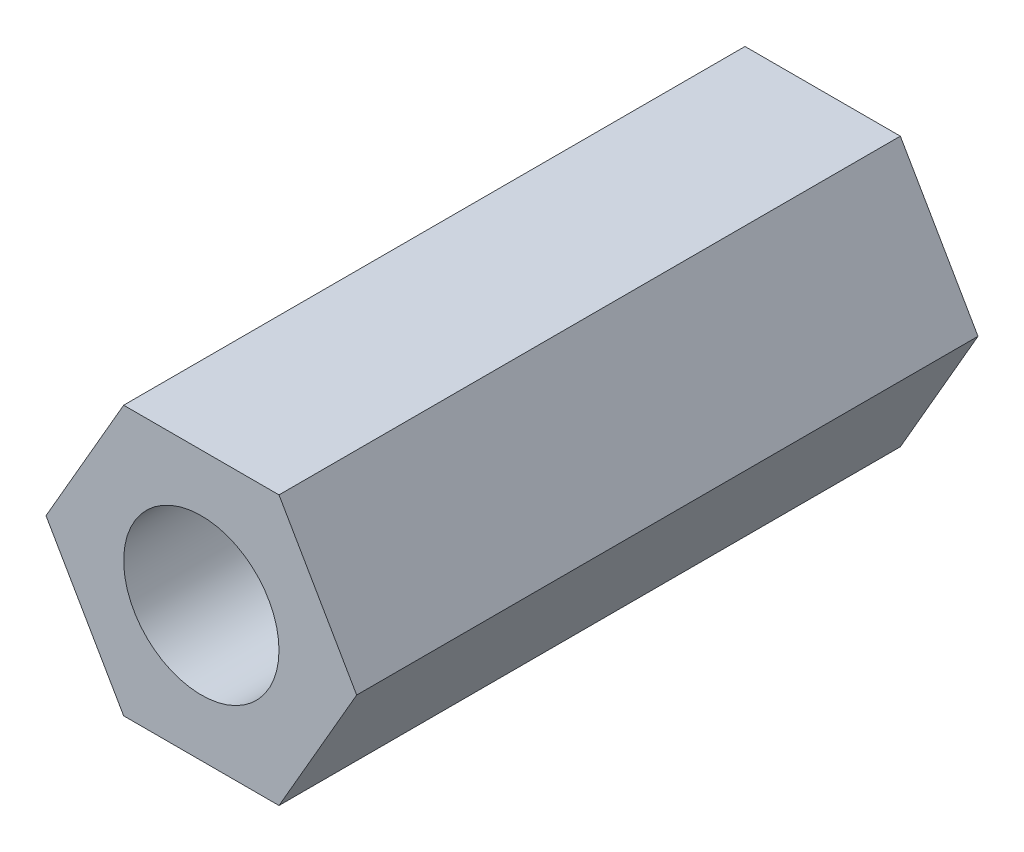
ISO-10303-21;
HEADER;
FILE_DESCRIPTION(('STEP AP214'),'2;1');
FILE_NAME('part.step','',(''),(''),'','','');
FILE_SCHEMA(('AUTOMOTIVE_DESIGN { 1 0 10303 214 1 1 1 1 }'));
ENDSEC;
DATA;
#1=APPLICATION_CONTEXT('core data for automotive mechanical design processes');
#2=APPLICATION_PROTOCOL_DEFINITION('international standard','automotive_design',2000,#1);
#3=PRODUCT_CONTEXT('',#1,'mechanical');
#4=PRODUCT('Part','Part','',(#3));
#5=PRODUCT_RELATED_PRODUCT_CATEGORY('part','',(#4));
#6=PRODUCT_DEFINITION_FORMATION('','',#4);
#7=PRODUCT_DEFINITION_CONTEXT('part definition',#1,'design');
#8=PRODUCT_DEFINITION('design','',#6,#7);
#9=PRODUCT_DEFINITION_SHAPE('','',#8);
#10=(LENGTH_UNIT() NAMED_UNIT(*) SI_UNIT(.MILLI.,.METRE.));
#11=(NAMED_UNIT(*) PLANE_ANGLE_UNIT() SI_UNIT($,.RADIAN.));
#12=(NAMED_UNIT(*) SI_UNIT($,.STERADIAN.) SOLID_ANGLE_UNIT());
#13=UNCERTAINTY_MEASURE_WITH_UNIT(LENGTH_MEASURE(1.E-05),#10,'distance_accuracy_value','');
#14=(GEOMETRIC_REPRESENTATION_CONTEXT(3) GLOBAL_UNCERTAINTY_ASSIGNED_CONTEXT((#13)) GLOBAL_UNIT_ASSIGNED_CONTEXT((#10,
#11,#12)) REPRESENTATION_CONTEXT('',''));
#15=CARTESIAN_POINT('',(0.,0.,0.));
#16=DIRECTION('',(0.,0.,1.));
#17=DIRECTION('',(1.,0.,0.));
#18=AXIS2_PLACEMENT_3D('',#15,#16,#17);
#19=CARTESIAN_POINT('',(-1.25,-2.1650635094611,10.));
#20=DIRECTION('',(0.866025403784439,-0.5,0.));
#21=DIRECTION('',(0.5,0.866025403784439,0.));
#22=AXIS2_PLACEMENT_3D('',#19,#20,#21);
#23=PLANE('',#22);
#24=DIRECTION('',(-0.5,-0.866025403784439,0.));
#25=VECTOR('',#24,1.);
#26=CARTESIAN_POINT('',(-1.25,-2.1650635094611,0.));
#27=LINE('',#26,#25);
#28=CARTESIAN_POINT('',(0.,0.,0.));
#29=VERTEX_POINT('',#28);
#30=CARTESIAN_POINT('',(-1.25,-2.1650635094611,0.));
#31=VERTEX_POINT('',#30);
#32=EDGE_CURVE('E120',#29,#31,#27,.T.);
#33=ORIENTED_EDGE('',*,*,#32,.T.);
#34=DIRECTION('',(0.,0.,-1.));
#35=VECTOR('',#34,1.);
#36=CARTESIAN_POINT('',(-1.25,-2.1650635094611,10.));
#37=LINE('',#36,#35);
#38=CARTESIAN_POINT('',(-1.25,-2.1650635094611,10.));
#39=VERTEX_POINT('',#38);
#40=EDGE_CURVE('E11',#39,#31,#37,.T.);
#41=ORIENTED_EDGE('',*,*,#40,.F.);
#42=DIRECTION('',(-0.5,-0.866025403784439,0.));
#43=VECTOR('',#42,1.);
#44=CARTESIAN_POINT('',(-1.25,-2.1650635094611,10.));
#45=LINE('',#44,#43);
#46=CARTESIAN_POINT('',(0.,0.,10.));
#47=VERTEX_POINT('',#46);
#48=EDGE_CURVE('E131',#47,#39,#45,.T.);
#49=ORIENTED_EDGE('',*,*,#48,.F.);
#50=DIRECTION('',(0.,0.,-1.));
#51=VECTOR('',#50,1.);
#52=CARTESIAN_POINT('',(0.,0.,10.));
#53=LINE('',#52,#51);
#54=EDGE_CURVE('E116',#47,#29,#53,.T.);
#55=ORIENTED_EDGE('',*,*,#54,.T.);
#56=EDGE_LOOP('',(#33,#41,#49,#55));
#57=FACE_BOUND('',#56,.T.);
#58=ADVANCED_FACE('F36',(#57),#23,.F.);
#59=CARTESIAN_POINT('',(0.,-4.33012701892219,10.));
#60=DIRECTION('',(0.866025403784439,0.5,0.));
#61=DIRECTION('',(-0.5,0.866025403784439,0.));
#62=AXIS2_PLACEMENT_3D('',#59,#60,#61);
#63=PLANE('',#62);
#64=DIRECTION('',(0.5,-0.866025403784439,0.));
#65=VECTOR('',#64,1.);
#66=CARTESIAN_POINT('',(0.,-4.33012701892219,0.));
#67=LINE('',#66,#65);
#68=CARTESIAN_POINT('',(0.,-4.33012701892219,0.));
#69=VERTEX_POINT('',#68);
#70=EDGE_CURVE('E123',#31,#69,#67,.T.);
#71=ORIENTED_EDGE('',*,*,#70,.T.);
#72=DIRECTION('',(0.,0.,-1.));
#73=VECTOR('',#72,1.);
#74=CARTESIAN_POINT('',(0.,-4.33012701892219,10.));
#75=LINE('',#74,#73);
#76=CARTESIAN_POINT('',(0.,-4.33012701892219,10.));
#77=VERTEX_POINT('',#76);
#78=EDGE_CURVE('E44',#77,#69,#75,.T.);
#79=ORIENTED_EDGE('',*,*,#78,.F.);
#80=DIRECTION('',(0.5,-0.866025403784439,0.));
#81=VECTOR('',#80,1.);
#82=CARTESIAN_POINT('',(0.,-4.33012701892219,10.));
#83=LINE('',#82,#81);
#84=EDGE_CURVE('E89',#39,#77,#83,.T.);
#85=ORIENTED_EDGE('',*,*,#84,.F.);
#86=ORIENTED_EDGE('',*,*,#40,.T.);
#87=EDGE_LOOP('',(#71,#79,#85,#86));
#88=FACE_BOUND('',#87,.T.);
#89=ADVANCED_FACE('F156',(#88),#63,.F.);
#90=CARTESIAN_POINT('',(2.5,-4.33012701892219,10.));
#91=DIRECTION('',(0.,1.,0.));
#92=DIRECTION('',(0.,0.,1.));
#93=AXIS2_PLACEMENT_3D('',#90,#91,#92);
#94=PLANE('',#93);
#95=DIRECTION('',(1.,0.,0.));
#96=VECTOR('',#95,1.);
#97=CARTESIAN_POINT('',(2.5,-4.33012701892219,0.));
#98=LINE('',#97,#96);
#99=CARTESIAN_POINT('',(2.5,-4.33012701892219,0.));
#100=VERTEX_POINT('',#99);
#101=EDGE_CURVE('E126',#69,#100,#98,.T.);
#102=ORIENTED_EDGE('',*,*,#101,.T.);
#103=DIRECTION('',(0.,0.,-1.));
#104=VECTOR('',#103,1.);
#105=CARTESIAN_POINT('',(2.5,-4.33012701892219,10.));
#106=LINE('',#105,#104);
#107=CARTESIAN_POINT('',(2.5,-4.33012701892219,10.));
#108=VERTEX_POINT('',#107);
#109=EDGE_CURVE('E111',#108,#100,#106,.T.);
#110=ORIENTED_EDGE('',*,*,#109,.F.);
#111=DIRECTION('',(1.,0.,0.));
#112=VECTOR('',#111,1.);
#113=CARTESIAN_POINT('',(2.5,-4.33012701892219,10.));
#114=LINE('',#113,#112);
#115=EDGE_CURVE('E102',#77,#108,#114,.T.);
#116=ORIENTED_EDGE('',*,*,#115,.F.);
#117=ORIENTED_EDGE('',*,*,#78,.T.);
#118=EDGE_LOOP('',(#102,#110,#116,#117));
#119=FACE_BOUND('',#118,.T.);
#120=ADVANCED_FACE('F137',(#119),#94,.F.);
#121=CARTESIAN_POINT('',(3.75,-2.1650635094611,10.));
#122=DIRECTION('',(-0.866025403784439,0.5,0.));
#123=DIRECTION('',(-0.5,-0.866025403784439,0.));
#124=AXIS2_PLACEMENT_3D('',#121,#122,#123);
#125=PLANE('',#124);
#126=DIRECTION('',(0.5,0.866025403784439,0.));
#127=VECTOR('',#126,1.);
#128=CARTESIAN_POINT('',(3.75,-2.1650635094611,0.));
#129=LINE('',#128,#127);
#130=CARTESIAN_POINT('',(3.75,-2.1650635094611,0.));
#131=VERTEX_POINT('',#130);
#132=EDGE_CURVE('E110',#100,#131,#129,.T.);
#133=ORIENTED_EDGE('',*,*,#132,.T.);
#134=DIRECTION('',(0.,0.,-1.));
#135=VECTOR('',#134,1.);
#136=CARTESIAN_POINT('',(3.75,-2.1650635094611,10.));
#137=LINE('',#136,#135);
#138=CARTESIAN_POINT('',(3.75,-2.1650635094611,10.));
#139=VERTEX_POINT('',#138);
#140=EDGE_CURVE('E107',#139,#131,#137,.T.);
#141=ORIENTED_EDGE('',*,*,#140,.F.);
#142=DIRECTION('',(0.5,0.866025403784439,0.));
#143=VECTOR('',#142,1.);
#144=CARTESIAN_POINT('',(3.75,-2.1650635094611,10.));
#145=LINE('',#144,#143);
#146=EDGE_CURVE('E96',#108,#139,#145,.T.);
#147=ORIENTED_EDGE('',*,*,#146,.F.);
#148=ORIENTED_EDGE('',*,*,#109,.T.);
#149=EDGE_LOOP('',(#133,#141,#147,#148));
#150=FACE_BOUND('',#149,.T.);
#151=ADVANCED_FACE('F108',(#150),#125,.F.);
#152=CARTESIAN_POINT('',(2.5,0.,10.));
#153=DIRECTION('',(-0.866025403784439,-0.5,0.));
#154=DIRECTION('',(0.5,-0.866025403784439,0.));
#155=AXIS2_PLACEMENT_3D('',#152,#153,#154);
#156=PLANE('',#155);
#157=DIRECTION('',(-0.5,0.866025403784439,0.));
#158=VECTOR('',#157,1.);
#159=CARTESIAN_POINT('',(2.5,0.,0.));
#160=LINE('',#159,#158);
#161=CARTESIAN_POINT('',(2.5,0.,0.));
#162=VERTEX_POINT('',#161);
#163=EDGE_CURVE('E75',#131,#162,#160,.T.);
#164=ORIENTED_EDGE('',*,*,#163,.T.);
#165=DIRECTION('',(0.,0.,-1.));
#166=VECTOR('',#165,1.);
#167=CARTESIAN_POINT('',(2.5,0.,10.));
#168=LINE('',#167,#166);
#169=CARTESIAN_POINT('',(2.5,0.,10.));
#170=VERTEX_POINT('',#169);
#171=EDGE_CURVE('E112',#170,#162,#168,.T.);
#172=ORIENTED_EDGE('',*,*,#171,.F.);
#173=DIRECTION('',(-0.5,0.866025403784439,0.));
#174=VECTOR('',#173,1.);
#175=CARTESIAN_POINT('',(2.5,0.,10.));
#176=LINE('',#175,#174);
#177=EDGE_CURVE('E100',#139,#170,#176,.T.);
#178=ORIENTED_EDGE('',*,*,#177,.F.);
#179=ORIENTED_EDGE('',*,*,#140,.T.);
#180=EDGE_LOOP('',(#164,#172,#178,#179));
#181=FACE_BOUND('',#180,.T.);
#182=ADVANCED_FACE('F114',(#181),#156,.F.);
#183=CARTESIAN_POINT('',(0.,0.,10.));
#184=DIRECTION('',(0.,-1.,0.));
#185=DIRECTION('',(0.,0.,-1.));
#186=AXIS2_PLACEMENT_3D('',#183,#184,#185);
#187=PLANE('',#186);
#188=DIRECTION('',(-1.,0.,0.));
#189=VECTOR('',#188,1.);
#190=CARTESIAN_POINT('',(0.,0.,0.));
#191=LINE('',#190,#189);
#192=EDGE_CURVE('E81',#162,#29,#191,.T.);
#193=ORIENTED_EDGE('',*,*,#192,.T.);
#194=ORIENTED_EDGE('',*,*,#54,.F.);
#195=DIRECTION('',(-1.,0.,0.));
#196=VECTOR('',#195,1.);
#197=CARTESIAN_POINT('',(0.,0.,10.));
#198=LINE('',#197,#196);
#199=EDGE_CURVE('E52',#170,#47,#198,.T.);
#200=ORIENTED_EDGE('',*,*,#199,.F.);
#201=ORIENTED_EDGE('',*,*,#171,.T.);
#202=EDGE_LOOP('',(#193,#194,#200,#201));
#203=FACE_BOUND('',#202,.T.);
#204=ADVANCED_FACE('F144',(#203),#187,.F.);
#205=CARTESIAN_POINT('',(0.,0.,10.));
#206=DIRECTION('',(0.,0.,-1.));
#207=DIRECTION('',(-1.,0.,0.));
#208=AXIS2_PLACEMENT_3D('',#205,#206,#207);
#209=PLANE('',#208);
#210=CARTESIAN_POINT('',(1.25,-2.1650635094611,10.));
#211=DIRECTION('',(0.,0.,1.));
#212=DIRECTION('',(1.,0.,0.));
#213=AXIS2_PLACEMENT_3D('',#210,#211,#212);
#214=CIRCLE('',#213,1.24999999999999);
#215=CARTESIAN_POINT('',(2.49999999999999,-2.1650635094611,10.));
#216=VERTEX_POINT('',#215);
#217=EDGE_CURVE('E213',#216,#216,#214,.T.);
#218=ORIENTED_EDGE('',*,*,#217,.F.);
#219=EDGE_LOOP('',(#218));
#220=FACE_BOUND('',#219,.T.);
#221=ORIENTED_EDGE('',*,*,#48,.T.);
#222=ORIENTED_EDGE('',*,*,#84,.T.);
#223=ORIENTED_EDGE('',*,*,#115,.T.);
#224=ORIENTED_EDGE('',*,*,#146,.T.);
#225=ORIENTED_EDGE('',*,*,#177,.T.);
#226=ORIENTED_EDGE('',*,*,#199,.T.);
#227=EDGE_LOOP('',(#221,#222,#223,#224,#225,#226));
#228=FACE_BOUND('',#227,.T.);
#229=ADVANCED_FACE('F98',(#220,#228),#209,.F.);
#230=CARTESIAN_POINT('',(0.,0.,0.));
#231=DIRECTION('',(0.,0.,-1.));
#232=DIRECTION('',(-1.,0.,0.));
#233=AXIS2_PLACEMENT_3D('',#230,#231,#232);
#234=PLANE('',#233);
#235=CARTESIAN_POINT('',(1.25,-2.1650635094611,0.));
#236=DIRECTION('',(0.,0.,1.));
#237=DIRECTION('',(1.,0.,0.));
#238=AXIS2_PLACEMENT_3D('',#235,#236,#237);
#239=CIRCLE('',#238,1.25);
#240=CARTESIAN_POINT('',(2.5,-2.1650635094611,0.));
#241=VERTEX_POINT('',#240);
#242=EDGE_CURVE('E124',#241,#241,#239,.T.);
#243=ORIENTED_EDGE('',*,*,#242,.T.);
#244=EDGE_LOOP('',(#243));
#245=FACE_BOUND('',#244,.T.);
#246=ORIENTED_EDGE('',*,*,#32,.F.);
#247=ORIENTED_EDGE('',*,*,#192,.F.);
#248=ORIENTED_EDGE('',*,*,#163,.F.);
#249=ORIENTED_EDGE('',*,*,#132,.F.);
#250=ORIENTED_EDGE('',*,*,#101,.F.);
#251=ORIENTED_EDGE('',*,*,#70,.F.);
#252=EDGE_LOOP('',(#246,#247,#248,#249,#250,#251));
#253=FACE_BOUND('',#252,.T.);
#254=ADVANCED_FACE('F140',(#245,#253),#234,.T.);
#255=CARTESIAN_POINT('',(1.25,-2.1650635094611,10.));
#256=DIRECTION('',(0.,0.,1.));
#257=DIRECTION('',(1.,0.,0.));
#258=AXIS2_PLACEMENT_3D('',#255,#256,#257);
#259=CYLINDRICAL_SURFACE('',#258,1.24999999999999);
#260=ORIENTED_EDGE('',*,*,#242,.F.);
#261=EDGE_LOOP('',(#260));
#262=FACE_BOUND('',#261,.T.);
#263=ORIENTED_EDGE('',*,*,#217,.T.);
#264=EDGE_LOOP('',(#263));
#265=FACE_BOUND('',#264,.T.);
#266=ADVANCED_FACE('F193',(#262,#265),#259,.F.);
#267=CLOSED_SHELL('',(#58,#89,#120,#151,#182,#204,#229,#254,#266));
#268=MANIFOLD_SOLID_BREP('B2',#267);
#269=ADVANCED_BREP_SHAPE_REPRESENTATION('',(#18,#268),#14);
#270=SHAPE_DEFINITION_REPRESENTATION(#9,#269);
ENDSEC;
END-ISO-10303-21;
